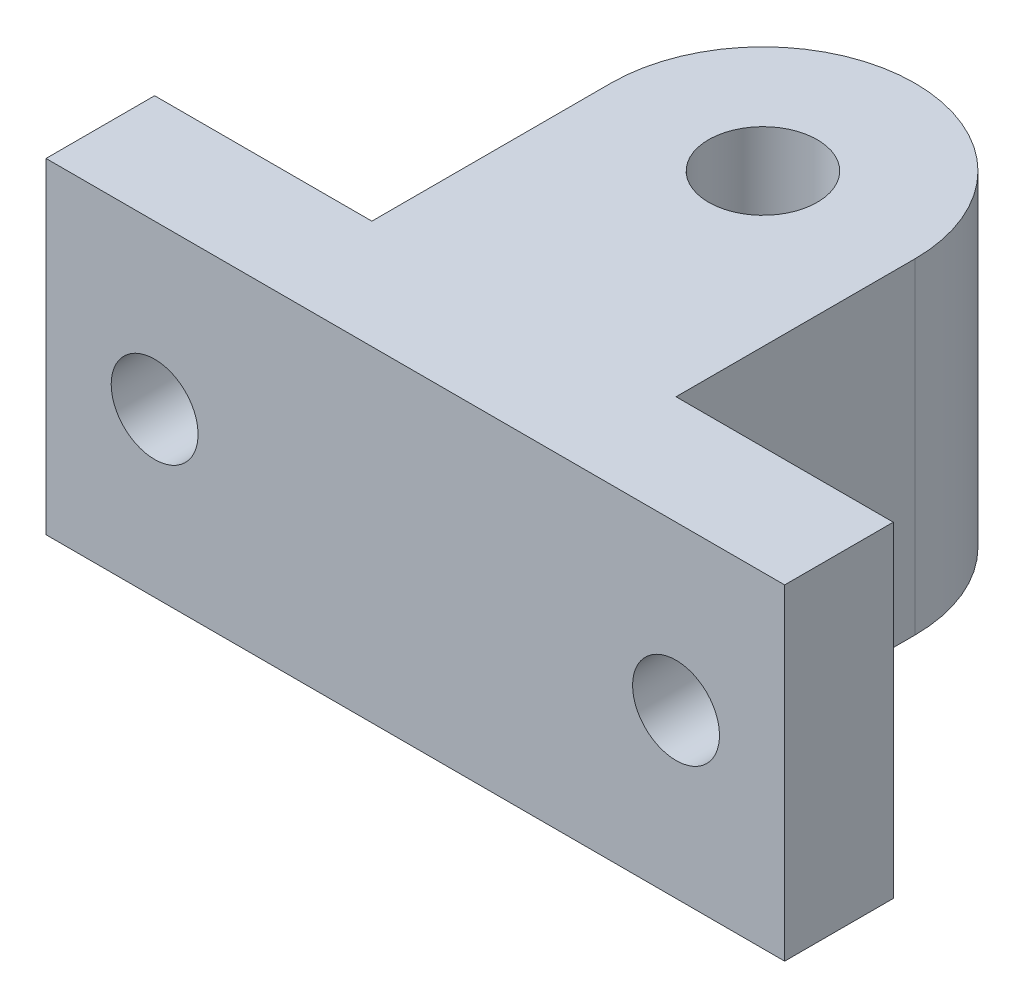
ISO-10303-21;
HEADER;
FILE_DESCRIPTION(('STEP AP214'),'2;1');
FILE_NAME('part.step','',(''),(''),'','','');
FILE_SCHEMA(('AUTOMOTIVE_DESIGN { 1 0 10303 214 1 1 1 1 }'));
ENDSEC;
DATA;
#1=APPLICATION_CONTEXT('core data for automotive mechanical design processes');
#2=APPLICATION_PROTOCOL_DEFINITION('international standard','automotive_design',2000,#1);
#3=PRODUCT_CONTEXT('',#1,'mechanical');
#4=PRODUCT('Part','Part','',(#3));
#5=PRODUCT_RELATED_PRODUCT_CATEGORY('part','',(#4));
#6=PRODUCT_DEFINITION_FORMATION('','',#4);
#7=PRODUCT_DEFINITION_CONTEXT('part definition',#1,'design');
#8=PRODUCT_DEFINITION('design','',#6,#7);
#9=PRODUCT_DEFINITION_SHAPE('','',#8);
#10=(LENGTH_UNIT() NAMED_UNIT(*) SI_UNIT(.MILLI.,.METRE.));
#11=(NAMED_UNIT(*) PLANE_ANGLE_UNIT() SI_UNIT($,.RADIAN.));
#12=(NAMED_UNIT(*) SI_UNIT($,.STERADIAN.) SOLID_ANGLE_UNIT());
#13=UNCERTAINTY_MEASURE_WITH_UNIT(LENGTH_MEASURE(1.E-05),#10,'distance_accuracy_value','');
#14=(GEOMETRIC_REPRESENTATION_CONTEXT(3) GLOBAL_UNCERTAINTY_ASSIGNED_CONTEXT((#13)) GLOBAL_UNIT_ASSIGNED_CONTEXT((#10,
#11,#12)) REPRESENTATION_CONTEXT('',''));
#15=CARTESIAN_POINT('',(0.,0.,0.));
#16=DIRECTION('',(0.,0.,1.));
#17=DIRECTION('',(1.,0.,0.));
#18=AXIS2_PLACEMENT_3D('',#15,#16,#17);
#19=CARTESIAN_POINT('',(0.,15.,0.));
#20=DIRECTION('',(0.,1.,0.));
#21=DIRECTION('',(0.,0.,1.));
#22=AXIS2_PLACEMENT_3D('',#19,#20,#21);
#23=PLANE('',#22);
#24=CARTESIAN_POINT('',(0.,15.,0.));
#25=DIRECTION('',(0.,1.,0.));
#26=DIRECTION('',(0.,0.,1.));
#27=AXIS2_PLACEMENT_3D('',#24,#25,#26);
#28=CIRCLE('',#27,7.);
#29=CARTESIAN_POINT('',(7.,15.,0.));
#30=VERTEX_POINT('',#29);
#31=CARTESIAN_POINT('',(-7.,15.,0.));
#32=VERTEX_POINT('',#31);
#33=EDGE_CURVE('E146',#30,#32,#28,.T.);
#34=ORIENTED_EDGE('',*,*,#33,.T.);
#35=DIRECTION('',(0.,0.,1.));
#36=VECTOR('',#35,1.);
#37=CARTESIAN_POINT('',(-7.,15.,0.));
#38=LINE('',#37,#36);
#39=CARTESIAN_POINT('',(-7.,15.,11.));
#40=VERTEX_POINT('',#39);
#41=EDGE_CURVE('E94',#32,#40,#38,.T.);
#42=ORIENTED_EDGE('',*,*,#41,.T.);
#43=DIRECTION('',(-1.,0.,0.));
#44=VECTOR('',#43,1.);
#45=CARTESIAN_POINT('',(-7.,15.,11.));
#46=LINE('',#45,#44);
#47=CARTESIAN_POINT('',(-17.,15.,11.));
#48=VERTEX_POINT('',#47);
#49=EDGE_CURVE('E162',#40,#48,#46,.T.);
#50=ORIENTED_EDGE('',*,*,#49,.T.);
#51=DIRECTION('',(0.,0.,1.));
#52=VECTOR('',#51,1.);
#53=CARTESIAN_POINT('',(-17.,15.,11.));
#54=LINE('',#53,#52);
#55=CARTESIAN_POINT('',(-17.,15.,16.));
#56=VERTEX_POINT('',#55);
#57=EDGE_CURVE('E175',#48,#56,#54,.T.);
#58=ORIENTED_EDGE('',*,*,#57,.T.);
#59=DIRECTION('',(1.,0.,0.));
#60=VECTOR('',#59,1.);
#61=CARTESIAN_POINT('',(-17.,15.,16.));
#62=LINE('',#61,#60);
#63=CARTESIAN_POINT('',(17.,15.,16.));
#64=VERTEX_POINT('',#63);
#65=EDGE_CURVE('E113',#56,#64,#62,.T.);
#66=ORIENTED_EDGE('',*,*,#65,.T.);
#67=DIRECTION('',(0.,0.,-1.));
#68=VECTOR('',#67,1.);
#69=CARTESIAN_POINT('',(17.,15.,16.));
#70=LINE('',#69,#68);
#71=CARTESIAN_POINT('',(17.,15.,11.));
#72=VERTEX_POINT('',#71);
#73=EDGE_CURVE('E107',#64,#72,#70,.T.);
#74=ORIENTED_EDGE('',*,*,#73,.T.);
#75=DIRECTION('',(-1.,0.,0.));
#76=VECTOR('',#75,1.);
#77=CARTESIAN_POINT('',(7.,15.,11.));
#78=LINE('',#77,#76);
#79=CARTESIAN_POINT('',(7.,15.,11.));
#80=VERTEX_POINT('',#79);
#81=EDGE_CURVE('E111',#72,#80,#78,.T.);
#82=ORIENTED_EDGE('',*,*,#81,.T.);
#83=DIRECTION('',(0.,0.,-1.));
#84=VECTOR('',#83,1.);
#85=CARTESIAN_POINT('',(7.,15.,0.));
#86=LINE('',#85,#84);
#87=EDGE_CURVE('E51',#80,#30,#86,.T.);
#88=ORIENTED_EDGE('',*,*,#87,.T.);
#89=EDGE_LOOP('',(#34,#42,#50,#58,#66,#74,#82,#88));
#90=FACE_BOUND('',#89,.T.);
#91=CARTESIAN_POINT('',(0.,15.,0.));
#92=DIRECTION('',(0.,1.,0.));
#93=DIRECTION('',(0.,0.,1.));
#94=AXIS2_PLACEMENT_3D('',#91,#92,#93);
#95=CIRCLE('',#94,2.5);
#96=CARTESIAN_POINT('',(0.,15.,2.5));
#97=VERTEX_POINT('',#96);
#98=EDGE_CURVE('E135',#97,#97,#95,.T.);
#99=ORIENTED_EDGE('',*,*,#98,.F.);
#100=EDGE_LOOP('',(#99));
#101=FACE_BOUND('',#100,.T.);
#102=ADVANCED_FACE('F33',(#90,#101),#23,.T.);
#103=CARTESIAN_POINT('',(0.,0.,0.));
#104=DIRECTION('',(0.,1.,0.));
#105=DIRECTION('',(0.,0.,1.));
#106=AXIS2_PLACEMENT_3D('',#103,#104,#105);
#107=PLANE('',#106);
#108=CARTESIAN_POINT('',(0.,0.,0.));
#109=DIRECTION('',(0.,1.,0.));
#110=DIRECTION('',(0.,0.,1.));
#111=AXIS2_PLACEMENT_3D('',#108,#109,#110);
#112=CIRCLE('',#111,7.);
#113=CARTESIAN_POINT('',(7.,0.,0.));
#114=VERTEX_POINT('',#113);
#115=CARTESIAN_POINT('',(-7.,0.,0.));
#116=VERTEX_POINT('',#115);
#117=EDGE_CURVE('E131',#114,#116,#112,.T.);
#118=ORIENTED_EDGE('',*,*,#117,.F.);
#119=DIRECTION('',(0.,0.,-1.));
#120=VECTOR('',#119,1.);
#121=CARTESIAN_POINT('',(7.,0.,0.));
#122=LINE('',#121,#120);
#123=CARTESIAN_POINT('',(7.,0.,11.));
#124=VERTEX_POINT('',#123);
#125=EDGE_CURVE('E86',#124,#114,#122,.T.);
#126=ORIENTED_EDGE('',*,*,#125,.F.);
#127=DIRECTION('',(-1.,0.,0.));
#128=VECTOR('',#127,1.);
#129=CARTESIAN_POINT('',(7.,0.,11.));
#130=LINE('',#129,#128);
#131=CARTESIAN_POINT('',(17.,0.,11.));
#132=VERTEX_POINT('',#131);
#133=EDGE_CURVE('E80',#132,#124,#130,.T.);
#134=ORIENTED_EDGE('',*,*,#133,.F.);
#135=DIRECTION('',(0.,0.,-1.));
#136=VECTOR('',#135,1.);
#137=CARTESIAN_POINT('',(17.,0.,16.));
#138=LINE('',#137,#136);
#139=CARTESIAN_POINT('',(17.,0.,16.));
#140=VERTEX_POINT('',#139);
#141=EDGE_CURVE('E121',#140,#132,#138,.T.);
#142=ORIENTED_EDGE('',*,*,#141,.F.);
#143=DIRECTION('',(1.,0.,0.));
#144=VECTOR('',#143,1.);
#145=CARTESIAN_POINT('',(-17.,0.,16.));
#146=LINE('',#145,#144);
#147=CARTESIAN_POINT('',(-17.,0.,16.));
#148=VERTEX_POINT('',#147);
#149=EDGE_CURVE('E141',#148,#140,#146,.T.);
#150=ORIENTED_EDGE('',*,*,#149,.F.);
#151=DIRECTION('',(0.,0.,1.));
#152=VECTOR('',#151,1.);
#153=CARTESIAN_POINT('',(-17.,0.,11.));
#154=LINE('',#153,#152);
#155=CARTESIAN_POINT('',(-17.,0.,11.));
#156=VERTEX_POINT('',#155);
#157=EDGE_CURVE('E139',#156,#148,#154,.T.);
#158=ORIENTED_EDGE('',*,*,#157,.F.);
#159=DIRECTION('',(-1.,0.,0.));
#160=VECTOR('',#159,1.);
#161=CARTESIAN_POINT('',(-7.,0.,11.));
#162=LINE('',#161,#160);
#163=CARTESIAN_POINT('',(-7.,0.,11.));
#164=VERTEX_POINT('',#163);
#165=EDGE_CURVE('E137',#164,#156,#162,.T.);
#166=ORIENTED_EDGE('',*,*,#165,.F.);
#167=DIRECTION('',(0.,0.,1.));
#168=VECTOR('',#167,1.);
#169=CARTESIAN_POINT('',(-7.,0.,0.));
#170=LINE('',#169,#168);
#171=EDGE_CURVE('E134',#116,#164,#170,.T.);
#172=ORIENTED_EDGE('',*,*,#171,.F.);
#173=EDGE_LOOP('',(#118,#126,#134,#142,#150,#158,#166,#172));
#174=FACE_BOUND('',#173,.T.);
#175=CARTESIAN_POINT('',(0.,0.,0.));
#176=DIRECTION('',(0.,1.,0.));
#177=DIRECTION('',(0.,0.,1.));
#178=AXIS2_PLACEMENT_3D('',#175,#176,#177);
#179=CIRCLE('',#178,2.5);
#180=CARTESIAN_POINT('',(0.,0.,2.5));
#181=VERTEX_POINT('',#180);
#182=EDGE_CURVE('E181',#181,#181,#179,.T.);
#183=ORIENTED_EDGE('',*,*,#182,.T.);
#184=EDGE_LOOP('',(#183));
#185=FACE_BOUND('',#184,.T.);
#186=ADVANCED_FACE('F166',(#174,#185),#107,.F.);
#187=CARTESIAN_POINT('',(0.,15.,0.));
#188=DIRECTION('',(0.,-1.,0.));
#189=DIRECTION('',(0.,0.,-1.));
#190=AXIS2_PLACEMENT_3D('',#187,#188,#189);
#191=CYLINDRICAL_SURFACE('',#190,7.);
#192=ORIENTED_EDGE('',*,*,#117,.T.);
#193=DIRECTION('',(0.,-1.,0.));
#194=VECTOR('',#193,1.);
#195=CARTESIAN_POINT('',(-7.,15.,0.));
#196=LINE('',#195,#194);
#197=EDGE_CURVE('E11',#32,#116,#196,.T.);
#198=ORIENTED_EDGE('',*,*,#197,.F.);
#199=ORIENTED_EDGE('',*,*,#33,.F.);
#200=DIRECTION('',(0.,-1.,0.));
#201=VECTOR('',#200,1.);
#202=CARTESIAN_POINT('',(7.,15.,0.));
#203=LINE('',#202,#201);
#204=EDGE_CURVE('E127',#30,#114,#203,.T.);
#205=ORIENTED_EDGE('',*,*,#204,.T.);
#206=EDGE_LOOP('',(#192,#198,#199,#205));
#207=FACE_BOUND('',#206,.T.);
#208=ADVANCED_FACE('F35',(#207),#191,.T.);
#209=CARTESIAN_POINT('',(-7.,15.,0.));
#210=DIRECTION('',(1.,0.,0.));
#211=DIRECTION('',(0.,0.,-1.));
#212=AXIS2_PLACEMENT_3D('',#209,#210,#211);
#213=PLANE('',#212);
#214=ORIENTED_EDGE('',*,*,#171,.T.);
#215=DIRECTION('',(0.,-1.,0.));
#216=VECTOR('',#215,1.);
#217=CARTESIAN_POINT('',(-7.,15.,11.));
#218=LINE('',#217,#216);
#219=EDGE_CURVE('E43',#40,#164,#218,.T.);
#220=ORIENTED_EDGE('',*,*,#219,.F.);
#221=ORIENTED_EDGE('',*,*,#41,.F.);
#222=ORIENTED_EDGE('',*,*,#197,.T.);
#223=EDGE_LOOP('',(#214,#220,#221,#222));
#224=FACE_BOUND('',#223,.T.);
#225=ADVANCED_FACE('F236',(#224),#213,.F.);
#226=CARTESIAN_POINT('',(-7.,15.,11.));
#227=DIRECTION('',(0.,0.,1.));
#228=DIRECTION('',(1.,0.,0.));
#229=AXIS2_PLACEMENT_3D('',#226,#227,#228);
#230=PLANE('',#229);
#231=CARTESIAN_POINT('',(-12.,7.5,11.));
#232=DIRECTION('',(0.,0.,-1.));
#233=DIRECTION('',(-1.,0.,0.));
#234=AXIS2_PLACEMENT_3D('',#231,#232,#233);
#235=CIRCLE('',#234,2.);
#236=CARTESIAN_POINT('',(-14.,7.5,11.));
#237=VERTEX_POINT('',#236);
#238=EDGE_CURVE('E186',#237,#237,#235,.T.);
#239=ORIENTED_EDGE('',*,*,#238,.F.);
#240=EDGE_LOOP('',(#239));
#241=FACE_BOUND('',#240,.T.);
#242=ORIENTED_EDGE('',*,*,#165,.T.);
#243=DIRECTION('',(0.,-1.,0.));
#244=VECTOR('',#243,1.);
#245=CARTESIAN_POINT('',(-17.,15.,11.));
#246=LINE('',#245,#244);
#247=EDGE_CURVE('E153',#48,#156,#246,.T.);
#248=ORIENTED_EDGE('',*,*,#247,.F.);
#249=ORIENTED_EDGE('',*,*,#49,.F.);
#250=ORIENTED_EDGE('',*,*,#219,.T.);
#251=EDGE_LOOP('',(#242,#248,#249,#250));
#252=FACE_BOUND('',#251,.T.);
#253=ADVANCED_FACE('F160',(#241,#252),#230,.F.);
#254=CARTESIAN_POINT('',(-17.,15.,11.));
#255=DIRECTION('',(1.,0.,0.));
#256=DIRECTION('',(0.,0.,-1.));
#257=AXIS2_PLACEMENT_3D('',#254,#255,#256);
#258=PLANE('',#257);
#259=ORIENTED_EDGE('',*,*,#157,.T.);
#260=DIRECTION('',(0.,-1.,0.));
#261=VECTOR('',#260,1.);
#262=CARTESIAN_POINT('',(-17.,15.,16.));
#263=LINE('',#262,#261);
#264=EDGE_CURVE('E150',#56,#148,#263,.T.);
#265=ORIENTED_EDGE('',*,*,#264,.F.);
#266=ORIENTED_EDGE('',*,*,#57,.F.);
#267=ORIENTED_EDGE('',*,*,#247,.T.);
#268=EDGE_LOOP('',(#259,#265,#266,#267));
#269=FACE_BOUND('',#268,.T.);
#270=ADVANCED_FACE('F171',(#269),#258,.F.);
#271=CARTESIAN_POINT('',(-17.,15.,16.));
#272=DIRECTION('',(0.,0.,-1.));
#273=DIRECTION('',(-1.,0.,0.));
#274=AXIS2_PLACEMENT_3D('',#271,#272,#273);
#275=PLANE('',#274);
#276=CARTESIAN_POINT('',(12.,7.5,16.));
#277=DIRECTION('',(0.,0.,-1.));
#278=DIRECTION('',(-1.,0.,0.));
#279=AXIS2_PLACEMENT_3D('',#276,#277,#278);
#280=CIRCLE('',#279,2.);
#281=CARTESIAN_POINT('',(10.,7.5,16.));
#282=VERTEX_POINT('',#281);
#283=EDGE_CURVE('E189',#282,#282,#280,.F.);
#284=ORIENTED_EDGE('',*,*,#283,.F.);
#285=EDGE_LOOP('',(#284));
#286=FACE_BOUND('',#285,.T.);
#287=CARTESIAN_POINT('',(-12.,7.5,16.));
#288=DIRECTION('',(0.,0.,-1.));
#289=DIRECTION('',(-1.,0.,0.));
#290=AXIS2_PLACEMENT_3D('',#287,#288,#289);
#291=CIRCLE('',#290,2.);
#292=CARTESIAN_POINT('',(-14.,7.5,16.));
#293=VERTEX_POINT('',#292);
#294=EDGE_CURVE('E37',#293,#293,#291,.T.);
#295=ORIENTED_EDGE('',*,*,#294,.T.);
#296=EDGE_LOOP('',(#295));
#297=FACE_BOUND('',#296,.T.);
#298=ORIENTED_EDGE('',*,*,#149,.T.);
#299=DIRECTION('',(0.,-1.,0.));
#300=VECTOR('',#299,1.);
#301=CARTESIAN_POINT('',(17.,15.,16.));
#302=LINE('',#301,#300);
#303=EDGE_CURVE('E122',#64,#140,#302,.T.);
#304=ORIENTED_EDGE('',*,*,#303,.F.);
#305=ORIENTED_EDGE('',*,*,#65,.F.);
#306=ORIENTED_EDGE('',*,*,#264,.T.);
#307=EDGE_LOOP('',(#298,#304,#305,#306));
#308=FACE_BOUND('',#307,.T.);
#309=ADVANCED_FACE('F174',(#286,#297,#308),#275,.F.);
#310=CARTESIAN_POINT('',(17.,15.,16.));
#311=DIRECTION('',(-1.,0.,0.));
#312=DIRECTION('',(0.,0.,1.));
#313=AXIS2_PLACEMENT_3D('',#310,#311,#312);
#314=PLANE('',#313);
#315=ORIENTED_EDGE('',*,*,#141,.T.);
#316=DIRECTION('',(0.,-1.,0.));
#317=VECTOR('',#316,1.);
#318=CARTESIAN_POINT('',(17.,15.,11.));
#319=LINE('',#318,#317);
#320=EDGE_CURVE('E118',#72,#132,#319,.T.);
#321=ORIENTED_EDGE('',*,*,#320,.F.);
#322=ORIENTED_EDGE('',*,*,#73,.F.);
#323=ORIENTED_EDGE('',*,*,#303,.T.);
#324=EDGE_LOOP('',(#315,#321,#322,#323));
#325=FACE_BOUND('',#324,.T.);
#326=ADVANCED_FACE('F119',(#325),#314,.F.);
#327=CARTESIAN_POINT('',(7.,15.,11.));
#328=DIRECTION('',(0.,0.,1.));
#329=DIRECTION('',(1.,0.,0.));
#330=AXIS2_PLACEMENT_3D('',#327,#328,#329);
#331=PLANE('',#330);
#332=CARTESIAN_POINT('',(12.,7.5,11.));
#333=DIRECTION('',(0.,0.,1.));
#334=DIRECTION('',(1.,0.,0.));
#335=AXIS2_PLACEMENT_3D('',#332,#333,#334);
#336=CIRCLE('',#335,2.);
#337=CARTESIAN_POINT('',(14.,7.5,11.));
#338=VERTEX_POINT('',#337);
#339=EDGE_CURVE('E192',#338,#338,#336,.T.);
#340=ORIENTED_EDGE('',*,*,#339,.T.);
#341=EDGE_LOOP('',(#340));
#342=FACE_BOUND('',#341,.T.);
#343=ORIENTED_EDGE('',*,*,#133,.T.);
#344=DIRECTION('',(0.,-1.,0.));
#345=VECTOR('',#344,1.);
#346=CARTESIAN_POINT('',(7.,15.,11.));
#347=LINE('',#346,#345);
#348=EDGE_CURVE('E123',#80,#124,#347,.T.);
#349=ORIENTED_EDGE('',*,*,#348,.F.);
#350=ORIENTED_EDGE('',*,*,#81,.F.);
#351=ORIENTED_EDGE('',*,*,#320,.T.);
#352=EDGE_LOOP('',(#343,#349,#350,#351));
#353=FACE_BOUND('',#352,.T.);
#354=ADVANCED_FACE('F125',(#342,#353),#331,.F.);
#355=CARTESIAN_POINT('',(7.,15.,0.));
#356=DIRECTION('',(-1.,0.,0.));
#357=DIRECTION('',(0.,0.,1.));
#358=AXIS2_PLACEMENT_3D('',#355,#356,#357);
#359=PLANE('',#358);
#360=ORIENTED_EDGE('',*,*,#125,.T.);
#361=ORIENTED_EDGE('',*,*,#204,.F.);
#362=ORIENTED_EDGE('',*,*,#87,.F.);
#363=ORIENTED_EDGE('',*,*,#348,.T.);
#364=EDGE_LOOP('',(#360,#361,#362,#363));
#365=FACE_BOUND('',#364,.T.);
#366=ADVANCED_FACE('F217',(#365),#359,.F.);
#367=CARTESIAN_POINT('',(0.,15.,0.));
#368=DIRECTION('',(0.,-1.,0.));
#369=DIRECTION('',(0.,0.,-1.));
#370=AXIS2_PLACEMENT_3D('',#367,#368,#369);
#371=CYLINDRICAL_SURFACE('',#370,2.5);
#372=ORIENTED_EDGE('',*,*,#98,.T.);
#373=EDGE_LOOP('',(#372));
#374=FACE_BOUND('',#373,.T.);
#375=ORIENTED_EDGE('',*,*,#182,.F.);
#376=EDGE_LOOP('',(#375));
#377=FACE_BOUND('',#376,.T.);
#378=ADVANCED_FACE('F211',(#374,#377),#371,.F.);
#379=CARTESIAN_POINT('',(-12.,7.5,26.));
#380=DIRECTION('',(0.,0.,-1.));
#381=DIRECTION('',(-1.,0.,0.));
#382=AXIS2_PLACEMENT_3D('',#379,#380,#381);
#383=CYLINDRICAL_SURFACE('',#382,2.);
#384=ORIENTED_EDGE('',*,*,#238,.T.);
#385=EDGE_LOOP('',(#384));
#386=FACE_BOUND('',#385,.T.);
#387=ORIENTED_EDGE('',*,*,#294,.F.);
#388=EDGE_LOOP('',(#387));
#389=FACE_BOUND('',#388,.T.);
#390=ADVANCED_FACE('F200',(#386,#389),#383,.F.);
#391=CARTESIAN_POINT('',(12.,7.5,26.));
#392=DIRECTION('',(0.,0.,-1.));
#393=DIRECTION('',(-1.,0.,0.));
#394=AXIS2_PLACEMENT_3D('',#391,#392,#393);
#395=CYLINDRICAL_SURFACE('',#394,2.);
#396=ORIENTED_EDGE('',*,*,#339,.F.);
#397=EDGE_LOOP('',(#396));
#398=FACE_BOUND('',#397,.T.);
#399=ORIENTED_EDGE('',*,*,#283,.T.);
#400=EDGE_LOOP('',(#399));
#401=FACE_BOUND('',#400,.T.);
#402=ADVANCED_FACE('F197',(#398,#401),#395,.F.);
#403=CLOSED_SHELL('',(#102,#186,#208,#225,#253,#270,#309,#326,#354,#366,#378,#390,#402));
#404=MANIFOLD_SOLID_BREP('B2',#403);
#405=ADVANCED_BREP_SHAPE_REPRESENTATION('',(#18,#404),#14);
#406=SHAPE_DEFINITION_REPRESENTATION(#9,#405);
ENDSEC;
END-ISO-10303-21;
